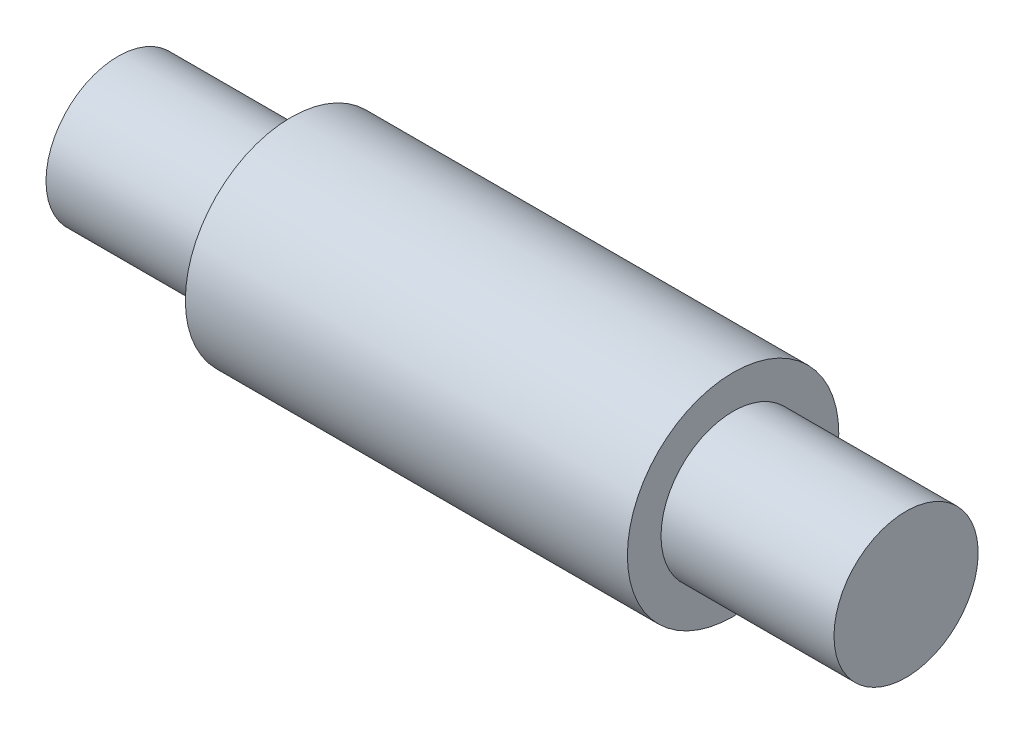
ISO-10303-21;
HEADER;
FILE_DESCRIPTION(('STEP AP214'),'2;1');
FILE_NAME('part.step','',(''),(''),'','','');
FILE_SCHEMA(('AUTOMOTIVE_DESIGN { 1 0 10303 214 1 1 1 1 }'));
ENDSEC;
DATA;
#1=APPLICATION_CONTEXT('core data for automotive mechanical design processes');
#2=APPLICATION_PROTOCOL_DEFINITION('international standard','automotive_design',2000,#1);
#3=PRODUCT_CONTEXT('',#1,'mechanical');
#4=PRODUCT('Part','Part','',(#3));
#5=PRODUCT_RELATED_PRODUCT_CATEGORY('part','',(#4));
#6=PRODUCT_DEFINITION_FORMATION('','',#4);
#7=PRODUCT_DEFINITION_CONTEXT('part definition',#1,'design');
#8=PRODUCT_DEFINITION('design','',#6,#7);
#9=PRODUCT_DEFINITION_SHAPE('','',#8);
#10=(LENGTH_UNIT() NAMED_UNIT(*) SI_UNIT(.MILLI.,.METRE.));
#11=(NAMED_UNIT(*) PLANE_ANGLE_UNIT() SI_UNIT($,.RADIAN.));
#12=(NAMED_UNIT(*) SI_UNIT($,.STERADIAN.) SOLID_ANGLE_UNIT());
#13=UNCERTAINTY_MEASURE_WITH_UNIT(LENGTH_MEASURE(1.E-05),#10,'distance_accuracy_value','');
#14=(GEOMETRIC_REPRESENTATION_CONTEXT(3) GLOBAL_UNCERTAINTY_ASSIGNED_CONTEXT((#13)) GLOBAL_UNIT_ASSIGNED_CONTEXT((#10,
#11,#12)) REPRESENTATION_CONTEXT('',''));
#15=CARTESIAN_POINT('',(0.,0.,0.));
#16=DIRECTION('',(0.,0.,1.));
#17=DIRECTION('',(1.,0.,0.));
#18=AXIS2_PLACEMENT_3D('',#15,#16,#17);
#19=CARTESIAN_POINT('',(-59.3450211608103,0.,0.));
#20=DIRECTION('',(1.,0.,0.));
#21=DIRECTION('',(0.,0.,-1.));
#22=AXIS2_PLACEMENT_3D('',#19,#20,#21);
#23=PLANE('',#22);
#24=CARTESIAN_POINT('',(-59.3450211608103,0.,0.));
#25=DIRECTION('',(-1.,0.,0.));
#26=DIRECTION('',(0.,0.,1.));
#27=AXIS2_PLACEMENT_3D('',#24,#25,#26);
#28=CIRCLE('',#27,7.5);
#29=CARTESIAN_POINT('',(-59.3450211608103,0.,7.5));
#30=VERTEX_POINT('',#29);
#31=EDGE_CURVE('E10',#30,#30,#28,.T.);
#32=ORIENTED_EDGE('',*,*,#31,.T.);
#33=EDGE_LOOP('',(#32));
#34=FACE_BOUND('',#33,.T.);
#35=ADVANCED_FACE('F35',(#34),#23,.F.);
#36=CARTESIAN_POINT('',(-59.3450211608103,0.,0.));
#37=DIRECTION('',(-1.,0.,0.));
#38=DIRECTION('',(0.,0.,1.));
#39=AXIS2_PLACEMENT_3D('',#36,#37,#38);
#40=CYLINDRICAL_SURFACE('',#39,7.5);
#41=ORIENTED_EDGE('',*,*,#31,.F.);
#42=EDGE_LOOP('',(#41));
#43=FACE_BOUND('',#42,.T.);
#44=CARTESIAN_POINT('',(-41.3450211608103,0.,0.));
#45=DIRECTION('',(-1.,0.,0.));
#46=DIRECTION('',(0.,0.,1.));
#47=AXIS2_PLACEMENT_3D('',#44,#45,#46);
#48=CIRCLE('',#47,7.5);
#49=CARTESIAN_POINT('',(-41.3450211608103,0.,7.5));
#50=VERTEX_POINT('',#49);
#51=EDGE_CURVE('E41',#50,#50,#48,.T.);
#52=ORIENTED_EDGE('',*,*,#51,.T.);
#53=EDGE_LOOP('',(#52));
#54=FACE_BOUND('',#53,.T.);
#55=ADVANCED_FACE('F73',(#43,#54),#40,.T.);
#56=CARTESIAN_POINT('',(-41.3450211608103,7.5,0.));
#57=DIRECTION('',(1.,0.,0.));
#58=DIRECTION('',(0.,0.,-1.));
#59=AXIS2_PLACEMENT_3D('',#56,#57,#58);
#60=PLANE('',#59);
#61=ORIENTED_EDGE('',*,*,#51,.F.);
#62=EDGE_LOOP('',(#61));
#63=FACE_BOUND('',#62,.T.);
#64=CARTESIAN_POINT('',(-41.3450211608103,0.,0.));
#65=DIRECTION('',(-1.,0.,0.));
#66=DIRECTION('',(0.,0.,1.));
#67=AXIS2_PLACEMENT_3D('',#64,#65,#66);
#68=CIRCLE('',#67,11.);
#69=CARTESIAN_POINT('',(-41.3450211608103,0.,11.));
#70=VERTEX_POINT('',#69);
#71=EDGE_CURVE('E45',#70,#70,#68,.T.);
#72=ORIENTED_EDGE('',*,*,#71,.T.);
#73=EDGE_LOOP('',(#72));
#74=FACE_BOUND('',#73,.T.);
#75=ADVANCED_FACE('F77',(#63,#74),#60,.F.);
#76=CARTESIAN_POINT('',(-59.3450211608103,0.,0.));
#77=DIRECTION('',(-1.,0.,0.));
#78=DIRECTION('',(0.,0.,1.));
#79=AXIS2_PLACEMENT_3D('',#76,#77,#78);
#80=CYLINDRICAL_SURFACE('',#79,11.);
#81=ORIENTED_EDGE('',*,*,#71,.F.);
#82=EDGE_LOOP('',(#81));
#83=FACE_BOUND('',#82,.T.);
#84=CARTESIAN_POINT('',(4.65497883918972,0.,0.));
#85=DIRECTION('',(-1.,0.,0.));
#86=DIRECTION('',(0.,0.,1.));
#87=AXIS2_PLACEMENT_3D('',#84,#85,#86);
#88=CIRCLE('',#87,11.);
#89=CARTESIAN_POINT('',(4.65497883918972,0.,11.));
#90=VERTEX_POINT('',#89);
#91=EDGE_CURVE('E49',#90,#90,#88,.T.);
#92=ORIENTED_EDGE('',*,*,#91,.T.);
#93=EDGE_LOOP('',(#92));
#94=FACE_BOUND('',#93,.T.);
#95=ADVANCED_FACE('F82',(#83,#94),#80,.T.);
#96=CARTESIAN_POINT('',(4.65497883918972,11.,0.));
#97=DIRECTION('',(-1.,0.,0.));
#98=DIRECTION('',(0.,0.,1.));
#99=AXIS2_PLACEMENT_3D('',#96,#97,#98);
#100=PLANE('',#99);
#101=ORIENTED_EDGE('',*,*,#91,.F.);
#102=EDGE_LOOP('',(#101));
#103=FACE_BOUND('',#102,.T.);
#104=CARTESIAN_POINT('',(4.65497883918972,0.,0.));
#105=DIRECTION('',(-1.,0.,0.));
#106=DIRECTION('',(0.,0.,1.));
#107=AXIS2_PLACEMENT_3D('',#104,#105,#106);
#108=CIRCLE('',#107,7.5);
#109=CARTESIAN_POINT('',(4.65497883918972,0.,7.5));
#110=VERTEX_POINT('',#109);
#111=EDGE_CURVE('E54',#110,#110,#108,.T.);
#112=ORIENTED_EDGE('',*,*,#111,.T.);
#113=EDGE_LOOP('',(#112));
#114=FACE_BOUND('',#113,.T.);
#115=ADVANCED_FACE('F69',(#103,#114),#100,.F.);
#116=CARTESIAN_POINT('',(-59.3450211608103,0.,0.));
#117=DIRECTION('',(-1.,0.,0.));
#118=DIRECTION('',(0.,0.,1.));
#119=AXIS2_PLACEMENT_3D('',#116,#117,#118);
#120=CYLINDRICAL_SURFACE('',#119,7.5);
#121=ORIENTED_EDGE('',*,*,#111,.F.);
#122=EDGE_LOOP('',(#121));
#123=FACE_BOUND('',#122,.T.);
#124=CARTESIAN_POINT('',(22.6549788391897,0.,0.));
#125=DIRECTION('',(-1.,0.,0.));
#126=DIRECTION('',(0.,0.,1.));
#127=AXIS2_PLACEMENT_3D('',#124,#125,#126);
#128=CIRCLE('',#127,7.5);
#129=CARTESIAN_POINT('',(22.6549788391897,0.,7.5));
#130=VERTEX_POINT('',#129);
#131=EDGE_CURVE('E57',#130,#130,#128,.T.);
#132=ORIENTED_EDGE('',*,*,#131,.T.);
#133=EDGE_LOOP('',(#132));
#134=FACE_BOUND('',#133,.T.);
#135=ADVANCED_FACE('F61',(#123,#134),#120,.T.);
#136=CARTESIAN_POINT('',(22.6549788391897,7.5,0.));
#137=DIRECTION('',(-1.,0.,0.));
#138=DIRECTION('',(0.,0.,1.));
#139=AXIS2_PLACEMENT_3D('',#136,#137,#138);
#140=PLANE('',#139);
#141=ORIENTED_EDGE('',*,*,#131,.F.);
#142=EDGE_LOOP('',(#141));
#143=FACE_BOUND('',#142,.T.);
#144=ADVANCED_FACE('F63',(#143),#140,.F.);
#145=CLOSED_SHELL('',(#35,#55,#75,#95,#115,#135,#144));
#146=MANIFOLD_SOLID_BREP('B2',#145);
#147=ADVANCED_BREP_SHAPE_REPRESENTATION('',(#18,#146),#14);
#148=SHAPE_DEFINITION_REPRESENTATION(#9,#147);
ENDSEC;
END-ISO-10303-21;
